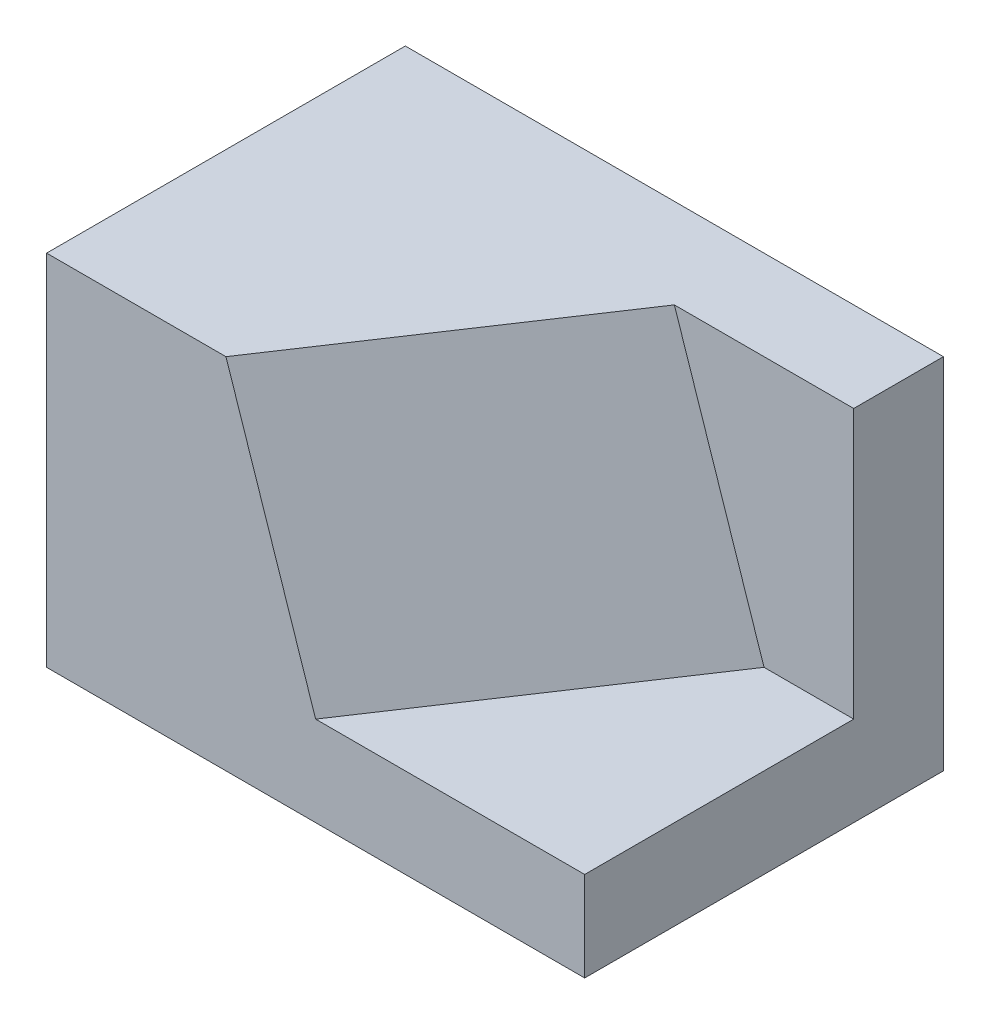
ISO-10303-21;
HEADER;
FILE_DESCRIPTION(('STEP AP214'),'2;1');
FILE_NAME('part.step','',(''),(''),'','','');
FILE_SCHEMA(('AUTOMOTIVE_DESIGN { 1 0 10303 214 1 1 1 1 }'));
ENDSEC;
DATA;
#1=APPLICATION_CONTEXT('core data for automotive mechanical design processes');
#2=APPLICATION_PROTOCOL_DEFINITION('international standard','automotive_design',2000,#1);
#3=PRODUCT_CONTEXT('',#1,'mechanical');
#4=PRODUCT('Part','Part','',(#3));
#5=PRODUCT_RELATED_PRODUCT_CATEGORY('part','',(#4));
#6=PRODUCT_DEFINITION_FORMATION('','',#4);
#7=PRODUCT_DEFINITION_CONTEXT('part definition',#1,'design');
#8=PRODUCT_DEFINITION('design','',#6,#7);
#9=PRODUCT_DEFINITION_SHAPE('','',#8);
#10=(LENGTH_UNIT() NAMED_UNIT(*) SI_UNIT(.MILLI.,.METRE.));
#11=(NAMED_UNIT(*) PLANE_ANGLE_UNIT() SI_UNIT($,.RADIAN.));
#12=(NAMED_UNIT(*) SI_UNIT($,.STERADIAN.) SOLID_ANGLE_UNIT());
#13=UNCERTAINTY_MEASURE_WITH_UNIT(LENGTH_MEASURE(1.E-05),#10,'distance_accuracy_value','');
#14=(GEOMETRIC_REPRESENTATION_CONTEXT(3) GLOBAL_UNCERTAINTY_ASSIGNED_CONTEXT((#13)) GLOBAL_UNIT_ASSIGNED_CONTEXT((#10,
#11,#12)) REPRESENTATION_CONTEXT('',''));
#15=CARTESIAN_POINT('',(0.,0.,0.));
#16=DIRECTION('',(0.,0.,1.));
#17=DIRECTION('',(1.,0.,0.));
#18=AXIS2_PLACEMENT_3D('',#15,#16,#17);
#19=CARTESIAN_POINT('',(0.,0.,10.));
#20=DIRECTION('',(0.,0.,1.));
#21=DIRECTION('',(1.,0.,0.));
#22=AXIS2_PLACEMENT_3D('',#19,#20,#21);
#23=PLANE('',#22);
#24=DIRECTION('',(-1.,0.,0.));
#25=VECTOR('',#24,1.);
#26=CARTESIAN_POINT('',(-30.,20.,10.));
#27=LINE('',#26,#25);
#28=CARTESIAN_POINT('',(30.,20.,10.));
#29=VERTEX_POINT('',#28);
#30=CARTESIAN_POINT('',(9.99999999999999,20.,10.));
#31=VERTEX_POINT('',#30);
#32=EDGE_CURVE('E121',#29,#31,#27,.T.);
#33=ORIENTED_EDGE('',*,*,#32,.T.);
#34=DIRECTION('',(-0.316227766016838,0.948683298050514,0.));
#35=VECTOR('',#34,1.);
#36=CARTESIAN_POINT('',(9.99999999999999,20.,10.));
#37=LINE('',#36,#35);
#38=CARTESIAN_POINT('',(20.,-10.,10.));
#39=VERTEX_POINT('',#38);
#40=EDGE_CURVE('E156',#39,#31,#37,.T.);
#41=ORIENTED_EDGE('',*,*,#40,.F.);
#42=DIRECTION('',(-1.,0.,0.));
#43=VECTOR('',#42,1.);
#44=CARTESIAN_POINT('',(20.,-10.,10.));
#45=LINE('',#44,#43);
#46=CARTESIAN_POINT('',(30.,-10.,10.));
#47=VERTEX_POINT('',#46);
#48=EDGE_CURVE('E136',#47,#39,#45,.T.);
#49=ORIENTED_EDGE('',*,*,#48,.F.);
#50=DIRECTION('',(0.,1.,0.));
#51=VECTOR('',#50,1.);
#52=CARTESIAN_POINT('',(30.,20.,10.));
#53=LINE('',#52,#51);
#54=EDGE_CURVE('E74',#47,#29,#53,.T.);
#55=ORIENTED_EDGE('',*,*,#54,.T.);
#56=EDGE_LOOP('',(#33,#41,#49,#55));
#57=FACE_BOUND('',#56,.T.);
#58=ADVANCED_FACE('F48',(#57),#23,.T.);
#59=CARTESIAN_POINT('',(30.,20.,10.));
#60=DIRECTION('',(-1.,0.,0.));
#61=DIRECTION('',(0.,-1.,0.));
#62=AXIS2_PLACEMENT_3D('',#59,#60,#61);
#63=PLANE('',#62);
#64=DIRECTION('',(0.,1.,0.));
#65=VECTOR('',#64,1.);
#66=CARTESIAN_POINT('',(30.,20.,0.));
#67=LINE('',#66,#65);
#68=CARTESIAN_POINT('',(30.,-20.,0.));
#69=VERTEX_POINT('',#68);
#70=CARTESIAN_POINT('',(30.,20.,0.));
#71=VERTEX_POINT('',#70);
#72=EDGE_CURVE('E119',#69,#71,#67,.T.);
#73=ORIENTED_EDGE('',*,*,#72,.T.);
#74=DIRECTION('',(0.,0.,-1.));
#75=VECTOR('',#74,1.);
#76=CARTESIAN_POINT('',(30.,20.,10.));
#77=LINE('',#76,#75);
#78=EDGE_CURVE('E12',#29,#71,#77,.T.);
#79=ORIENTED_EDGE('',*,*,#78,.F.);
#80=ORIENTED_EDGE('',*,*,#54,.F.);
#81=DIRECTION('',(0.,0.,-1.));
#82=VECTOR('',#81,1.);
#83=CARTESIAN_POINT('',(30.,-10.,40.));
#84=LINE('',#83,#82);
#85=CARTESIAN_POINT('',(30.,-10.,40.));
#86=VERTEX_POINT('',#85);
#87=EDGE_CURVE('E66',#86,#47,#84,.T.);
#88=ORIENTED_EDGE('',*,*,#87,.F.);
#89=DIRECTION('',(0.,1.,0.));
#90=VECTOR('',#89,1.);
#91=CARTESIAN_POINT('',(30.,-20.,40.));
#92=LINE('',#91,#90);
#93=CARTESIAN_POINT('',(30.,-20.,40.));
#94=VERTEX_POINT('',#93);
#95=EDGE_CURVE('E147',#94,#86,#92,.T.);
#96=ORIENTED_EDGE('',*,*,#95,.F.);
#97=DIRECTION('',(0.,0.,-1.));
#98=VECTOR('',#97,1.);
#99=CARTESIAN_POINT('',(30.,-20.,10.));
#100=LINE('',#99,#98);
#101=EDGE_CURVE('E114',#94,#69,#100,.T.);
#102=ORIENTED_EDGE('',*,*,#101,.T.);
#103=EDGE_LOOP('',(#73,#79,#80,#88,#96,#102));
#104=FACE_BOUND('',#103,.T.);
#105=ADVANCED_FACE('F50',(#104),#63,.F.);
#106=CARTESIAN_POINT('',(-30.,20.,10.));
#107=DIRECTION('',(0.,-1.,0.));
#108=DIRECTION('',(0.,0.,-1.));
#109=AXIS2_PLACEMENT_3D('',#106,#107,#108);
#110=PLANE('',#109);
#111=DIRECTION('',(-1.,0.,0.));
#112=VECTOR('',#111,1.);
#113=CARTESIAN_POINT('',(-30.,20.,0.));
#114=LINE('',#113,#112);
#115=CARTESIAN_POINT('',(-30.,20.,0.));
#116=VERTEX_POINT('',#115);
#117=EDGE_CURVE('E104',#71,#116,#114,.T.);
#118=ORIENTED_EDGE('',*,*,#117,.T.);
#119=DIRECTION('',(0.,0.,-1.));
#120=VECTOR('',#119,1.);
#121=CARTESIAN_POINT('',(-30.,20.,10.));
#122=LINE('',#121,#120);
#123=CARTESIAN_POINT('',(-30.,20.,40.));
#124=VERTEX_POINT('',#123);
#125=EDGE_CURVE('E58',#124,#116,#122,.T.);
#126=ORIENTED_EDGE('',*,*,#125,.F.);
#127=DIRECTION('',(-1.,0.,0.));
#128=VECTOR('',#127,1.);
#129=CARTESIAN_POINT('',(-10.,20.,40.));
#130=LINE('',#129,#128);
#131=CARTESIAN_POINT('',(-10.,20.,40.));
#132=VERTEX_POINT('',#131);
#133=EDGE_CURVE('E188',#132,#124,#130,.T.);
#134=ORIENTED_EDGE('',*,*,#133,.F.);
#135=DIRECTION('',(0.554700196225229,0.,-0.832050294337844));
#136=VECTOR('',#135,1.);
#137=CARTESIAN_POINT('',(-10.,20.,40.));
#138=LINE('',#137,#136);
#139=EDGE_CURVE('E212',#132,#31,#138,.T.);
#140=ORIENTED_EDGE('',*,*,#139,.T.);
#141=ORIENTED_EDGE('',*,*,#32,.F.);
#142=ORIENTED_EDGE('',*,*,#78,.T.);
#143=EDGE_LOOP('',(#118,#126,#134,#140,#141,#142));
#144=FACE_BOUND('',#143,.T.);
#145=ADVANCED_FACE('F138',(#144),#110,.F.);
#146=CARTESIAN_POINT('',(-30.,20.,10.));
#147=DIRECTION('',(1.,0.,0.));
#148=DIRECTION('',(0.,1.,0.));
#149=AXIS2_PLACEMENT_3D('',#146,#147,#148);
#150=PLANE('',#149);
#151=DIRECTION('',(0.,-1.,0.));
#152=VECTOR('',#151,1.);
#153=CARTESIAN_POINT('',(-30.,20.,0.));
#154=LINE('',#153,#152);
#155=CARTESIAN_POINT('',(-30.,-20.,0.));
#156=VERTEX_POINT('',#155);
#157=EDGE_CURVE('E93',#116,#156,#154,.T.);
#158=ORIENTED_EDGE('',*,*,#157,.T.);
#159=DIRECTION('',(0.,0.,-1.));
#160=VECTOR('',#159,1.);
#161=CARTESIAN_POINT('',(-30.,-20.,10.));
#162=LINE('',#161,#160);
#163=CARTESIAN_POINT('',(-30.,-20.,40.));
#164=VERTEX_POINT('',#163);
#165=EDGE_CURVE('E98',#164,#156,#162,.T.);
#166=ORIENTED_EDGE('',*,*,#165,.F.);
#167=DIRECTION('',(0.,-1.,0.));
#168=VECTOR('',#167,1.);
#169=CARTESIAN_POINT('',(-30.,20.,40.));
#170=LINE('',#169,#168);
#171=EDGE_CURVE('E293',#124,#164,#170,.T.);
#172=ORIENTED_EDGE('',*,*,#171,.F.);
#173=ORIENTED_EDGE('',*,*,#125,.T.);
#174=EDGE_LOOP('',(#158,#166,#172,#173));
#175=FACE_BOUND('',#174,.T.);
#176=ADVANCED_FACE('F95',(#175),#150,.F.);
#177=CARTESIAN_POINT('',(-30.,-20.,10.));
#178=DIRECTION('',(0.,1.,0.));
#179=DIRECTION('',(0.,0.,1.));
#180=AXIS2_PLACEMENT_3D('',#177,#178,#179);
#181=PLANE('',#180);
#182=DIRECTION('',(1.,0.,0.));
#183=VECTOR('',#182,1.);
#184=CARTESIAN_POINT('',(-30.,-20.,0.));
#185=LINE('',#184,#183);
#186=EDGE_CURVE('E103',#156,#69,#185,.T.);
#187=ORIENTED_EDGE('',*,*,#186,.T.);
#188=ORIENTED_EDGE('',*,*,#101,.F.);
#189=DIRECTION('',(1.,0.,0.));
#190=VECTOR('',#189,1.);
#191=CARTESIAN_POINT('',(-30.,-20.,40.));
#192=LINE('',#191,#190);
#193=EDGE_CURVE('E111',#164,#94,#192,.T.);
#194=ORIENTED_EDGE('',*,*,#193,.F.);
#195=ORIENTED_EDGE('',*,*,#165,.T.);
#196=EDGE_LOOP('',(#187,#188,#194,#195));
#197=FACE_BOUND('',#196,.T.);
#198=ADVANCED_FACE('F107',(#197),#181,.F.);
#199=CARTESIAN_POINT('',(0.,0.,0.));
#200=DIRECTION('',(0.,0.,1.));
#201=DIRECTION('',(1.,0.,0.));
#202=AXIS2_PLACEMENT_3D('',#199,#200,#201);
#203=PLANE('',#202);
#204=ORIENTED_EDGE('',*,*,#72,.F.);
#205=ORIENTED_EDGE('',*,*,#186,.F.);
#206=ORIENTED_EDGE('',*,*,#157,.F.);
#207=ORIENTED_EDGE('',*,*,#117,.F.);
#208=EDGE_LOOP('',(#204,#205,#206,#207));
#209=FACE_BOUND('',#208,.T.);
#210=ADVANCED_FACE('F117',(#209),#203,.F.);
#211=CARTESIAN_POINT('',(0.,0.,40.));
#212=DIRECTION('',(0.,0.,1.));
#213=DIRECTION('',(1.,0.,0.));
#214=AXIS2_PLACEMENT_3D('',#211,#212,#213);
#215=PLANE('',#214);
#216=DIRECTION('',(-0.316227766016838,0.948683298050514,0.));
#217=VECTOR('',#216,1.);
#218=CARTESIAN_POINT('',(0.,-10.,40.));
#219=LINE('',#218,#217);
#220=CARTESIAN_POINT('',(0.,-10.,40.));
#221=VERTEX_POINT('',#220);
#222=EDGE_CURVE('E232',#221,#132,#219,.T.);
#223=ORIENTED_EDGE('',*,*,#222,.T.);
#224=ORIENTED_EDGE('',*,*,#133,.T.);
#225=ORIENTED_EDGE('',*,*,#171,.T.);
#226=ORIENTED_EDGE('',*,*,#193,.T.);
#227=ORIENTED_EDGE('',*,*,#95,.T.);
#228=DIRECTION('',(-1.,0.,0.));
#229=VECTOR('',#228,1.);
#230=CARTESIAN_POINT('',(30.,-10.,40.));
#231=LINE('',#230,#229);
#232=EDGE_CURVE('E225',#86,#221,#231,.T.);
#233=ORIENTED_EDGE('',*,*,#232,.T.);
#234=EDGE_LOOP('',(#223,#224,#225,#226,#227,#233));
#235=FACE_BOUND('',#234,.T.);
#236=ADVANCED_FACE('F249',(#235),#215,.T.);
#237=CARTESIAN_POINT('',(15.,5.,10.));
#238=DIRECTION('',(0.801783725737273,0.267261241912424,0.534522483824849));
#239=DIRECTION('',(0.554700196225229,0.,-0.832050294337844));
#240=AXIS2_PLACEMENT_3D('',#237,#238,#239);
#241=PLANE('',#240);
#242=DIRECTION('',(0.554700196225229,0.,-0.832050294337844));
#243=VECTOR('',#242,1.);
#244=CARTESIAN_POINT('',(0.,-10.,40.));
#245=LINE('',#244,#243);
#246=EDGE_CURVE('E210',#221,#39,#245,.T.);
#247=ORIENTED_EDGE('',*,*,#246,.T.);
#248=ORIENTED_EDGE('',*,*,#40,.T.);
#249=ORIENTED_EDGE('',*,*,#139,.F.);
#250=ORIENTED_EDGE('',*,*,#222,.F.);
#251=EDGE_LOOP('',(#247,#248,#249,#250));
#252=FACE_BOUND('',#251,.T.);
#253=ADVANCED_FACE('F240',(#252),#241,.T.);
#254=CARTESIAN_POINT('',(0.,-10.,0.));
#255=DIRECTION('',(0.,1.,0.));
#256=DIRECTION('',(0.,0.,1.));
#257=AXIS2_PLACEMENT_3D('',#254,#255,#256);
#258=PLANE('',#257);
#259=ORIENTED_EDGE('',*,*,#87,.T.);
#260=ORIENTED_EDGE('',*,*,#48,.T.);
#261=ORIENTED_EDGE('',*,*,#246,.F.);
#262=ORIENTED_EDGE('',*,*,#232,.F.);
#263=EDGE_LOOP('',(#259,#260,#261,#262));
#264=FACE_BOUND('',#263,.T.);
#265=ADVANCED_FACE('F248',(#264),#258,.T.);
#266=CLOSED_SHELL('',(#58,#105,#145,#176,#198,#210,#236,#253,#265));
#267=MANIFOLD_SOLID_BREP('B2',#266);
#268=ADVANCED_BREP_SHAPE_REPRESENTATION('',(#18,#267),#14);
#269=SHAPE_DEFINITION_REPRESENTATION(#9,#268);
ENDSEC;
END-ISO-10303-21;
